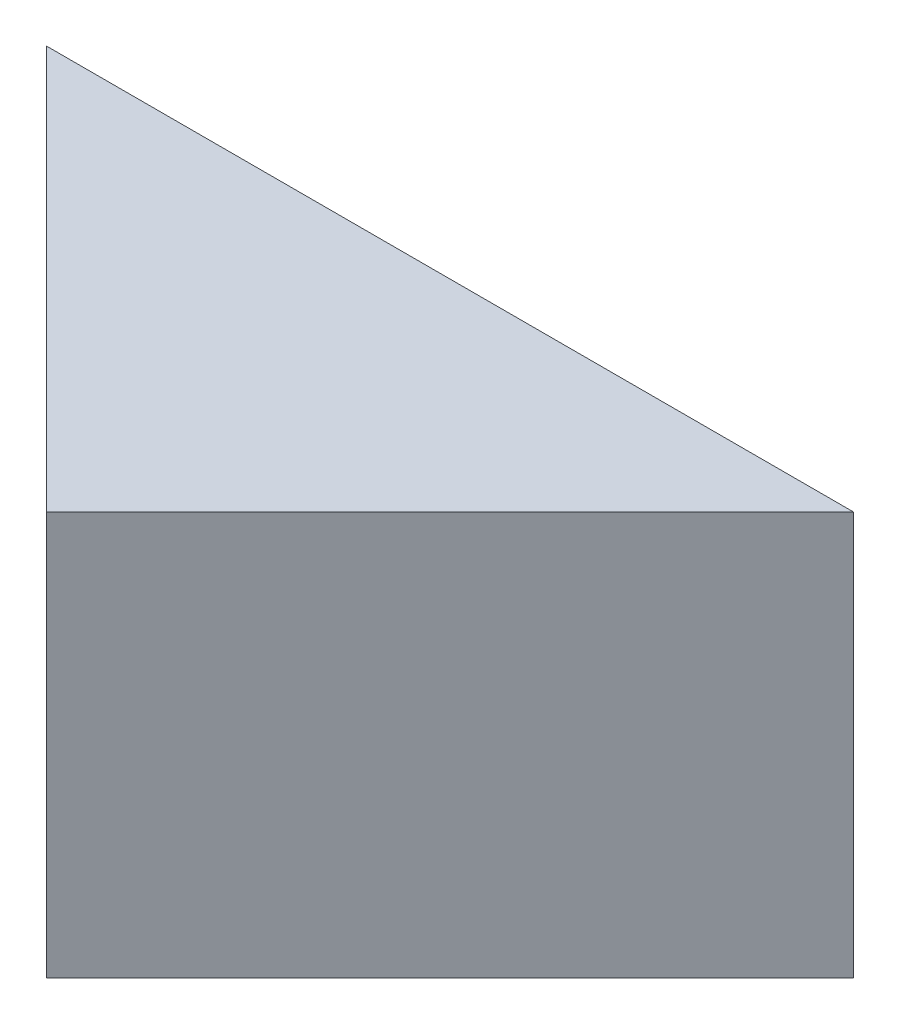
ISO-10303-21;
HEADER;
FILE_DESCRIPTION(('STEP AP214'),'2;1');
FILE_NAME('part.step','',(''),(''),'','','');
FILE_SCHEMA(('AUTOMOTIVE_DESIGN { 1 0 10303 214 1 1 1 1 }'));
ENDSEC;
DATA;
#1=APPLICATION_CONTEXT('core data for automotive mechanical design processes');
#2=APPLICATION_PROTOCOL_DEFINITION('international standard','automotive_design',2000,#1);
#3=PRODUCT_CONTEXT('',#1,'mechanical');
#4=PRODUCT('Part','Part','',(#3));
#5=PRODUCT_RELATED_PRODUCT_CATEGORY('part','',(#4));
#6=PRODUCT_DEFINITION_FORMATION('','',#4);
#7=PRODUCT_DEFINITION_CONTEXT('part definition',#1,'design');
#8=PRODUCT_DEFINITION('design','',#6,#7);
#9=PRODUCT_DEFINITION_SHAPE('','',#8);
#10=(LENGTH_UNIT() NAMED_UNIT(*) SI_UNIT(.MILLI.,.METRE.));
#11=(NAMED_UNIT(*) PLANE_ANGLE_UNIT() SI_UNIT($,.RADIAN.));
#12=(NAMED_UNIT(*) SI_UNIT($,.STERADIAN.) SOLID_ANGLE_UNIT());
#13=UNCERTAINTY_MEASURE_WITH_UNIT(LENGTH_MEASURE(1.E-05),#10,'distance_accuracy_value','');
#14=(GEOMETRIC_REPRESENTATION_CONTEXT(3) GLOBAL_UNCERTAINTY_ASSIGNED_CONTEXT((#13)) GLOBAL_UNIT_ASSIGNED_CONTEXT((#10,
#11,#12)) REPRESENTATION_CONTEXT('',''));
#15=CARTESIAN_POINT('',(0.,0.,0.));
#16=DIRECTION('',(0.,0.,1.));
#17=DIRECTION('',(1.,0.,0.));
#18=AXIS2_PLACEMENT_3D('',#15,#16,#17);
#19=CARTESIAN_POINT('',(20.,20.,0.));
#20=DIRECTION('',(-0.707106781186544,0.,-0.707106781186551));
#21=DIRECTION('',(-0.707106781186551,0.,0.707106781186544));
#22=AXIS2_PLACEMENT_3D('',#19,#20,#21);
#23=PLANE('',#22);
#24=DIRECTION('',(0.707106781186551,0.,-0.707106781186544));
#25=VECTOR('',#24,1.);
#26=CARTESIAN_POINT('',(20.,0.,0.));
#27=LINE('',#26,#25);
#28=CARTESIAN_POINT('',(0.,0.,19.9999999999998));
#29=VERTEX_POINT('',#28);
#30=CARTESIAN_POINT('',(20.,0.,0.));
#31=VERTEX_POINT('',#30);
#32=EDGE_CURVE('E89',#29,#31,#27,.T.);
#33=ORIENTED_EDGE('',*,*,#32,.T.);
#34=DIRECTION('',(0.,-1.,0.));
#35=VECTOR('',#34,1.);
#36=CARTESIAN_POINT('',(20.,20.,0.));
#37=LINE('',#36,#35);
#38=CARTESIAN_POINT('',(20.,20.,0.));
#39=VERTEX_POINT('',#38);
#40=EDGE_CURVE('E11',#39,#31,#37,.T.);
#41=ORIENTED_EDGE('',*,*,#40,.F.);
#42=DIRECTION('',(0.707106781186551,0.,-0.707106781186544));
#43=VECTOR('',#42,1.);
#44=CARTESIAN_POINT('',(20.,20.,0.));
#45=LINE('',#44,#43);
#46=CARTESIAN_POINT('',(0.,20.,19.9999999999998));
#47=VERTEX_POINT('',#46);
#48=EDGE_CURVE('E81',#47,#39,#45,.T.);
#49=ORIENTED_EDGE('',*,*,#48,.F.);
#50=DIRECTION('',(0.,-1.,0.));
#51=VECTOR('',#50,1.);
#52=CARTESIAN_POINT('',(0.,20.,19.9999999999998));
#53=LINE('',#52,#51);
#54=EDGE_CURVE('E90',#47,#29,#53,.T.);
#55=ORIENTED_EDGE('',*,*,#54,.T.);
#56=EDGE_LOOP('',(#33,#41,#49,#55));
#57=FACE_BOUND('',#56,.T.);
#58=ADVANCED_FACE('F39',(#57),#23,.F.);
#59=CARTESIAN_POINT('',(-20.,20.,0.));
#60=DIRECTION('',(0.,0.,1.));
#61=DIRECTION('',(1.,0.,0.));
#62=AXIS2_PLACEMENT_3D('',#59,#60,#61);
#63=PLANE('',#62);
#64=DIRECTION('',(-1.,0.,0.));
#65=VECTOR('',#64,1.);
#66=CARTESIAN_POINT('',(-20.,0.,0.));
#67=LINE('',#66,#65);
#68=CARTESIAN_POINT('',(-20.,0.,0.));
#69=VERTEX_POINT('',#68);
#70=EDGE_CURVE('E68',#31,#69,#67,.T.);
#71=ORIENTED_EDGE('',*,*,#70,.T.);
#72=DIRECTION('',(0.,-1.,0.));
#73=VECTOR('',#72,1.);
#74=CARTESIAN_POINT('',(-20.,20.,0.));
#75=LINE('',#74,#73);
#76=CARTESIAN_POINT('',(-20.,20.,0.));
#77=VERTEX_POINT('',#76);
#78=EDGE_CURVE('E48',#77,#69,#75,.T.);
#79=ORIENTED_EDGE('',*,*,#78,.F.);
#80=DIRECTION('',(-1.,0.,0.));
#81=VECTOR('',#80,1.);
#82=CARTESIAN_POINT('',(-20.,20.,0.));
#83=LINE('',#82,#81);
#84=EDGE_CURVE('E76',#39,#77,#83,.T.);
#85=ORIENTED_EDGE('',*,*,#84,.F.);
#86=ORIENTED_EDGE('',*,*,#40,.T.);
#87=EDGE_LOOP('',(#71,#79,#85,#86));
#88=FACE_BOUND('',#87,.T.);
#89=ADVANCED_FACE('F77',(#88),#63,.F.);
#90=CARTESIAN_POINT('',(-20.,20.,0.));
#91=DIRECTION('',(0.707106781186544,0.,-0.707106781186551));
#92=DIRECTION('',(-0.707106781186551,0.,-0.707106781186544));
#93=AXIS2_PLACEMENT_3D('',#90,#91,#92);
#94=PLANE('',#93);
#95=DIRECTION('',(0.707106781186551,0.,0.707106781186544));
#96=VECTOR('',#95,1.);
#97=CARTESIAN_POINT('',(-20.,0.,0.));
#98=LINE('',#97,#96);
#99=EDGE_CURVE('E73',#69,#29,#98,.T.);
#100=ORIENTED_EDGE('',*,*,#99,.T.);
#101=ORIENTED_EDGE('',*,*,#54,.F.);
#102=DIRECTION('',(0.707106781186551,0.,0.707106781186544));
#103=VECTOR('',#102,1.);
#104=CARTESIAN_POINT('',(-20.,20.,0.));
#105=LINE('',#104,#103);
#106=EDGE_CURVE('E56',#77,#47,#105,.T.);
#107=ORIENTED_EDGE('',*,*,#106,.F.);
#108=ORIENTED_EDGE('',*,*,#78,.T.);
#109=EDGE_LOOP('',(#100,#101,#107,#108));
#110=FACE_BOUND('',#109,.T.);
#111=ADVANCED_FACE('F102',(#110),#94,.F.);
#112=CARTESIAN_POINT('',(0.,20.,0.));
#113=DIRECTION('',(0.,1.,0.));
#114=DIRECTION('',(0.,0.,1.));
#115=AXIS2_PLACEMENT_3D('',#112,#113,#114);
#116=PLANE('',#115);
#117=ORIENTED_EDGE('',*,*,#48,.T.);
#118=ORIENTED_EDGE('',*,*,#84,.T.);
#119=ORIENTED_EDGE('',*,*,#106,.T.);
#120=EDGE_LOOP('',(#117,#118,#119));
#121=FACE_BOUND('',#120,.T.);
#122=ADVANCED_FACE('F84',(#121),#116,.T.);
#123=CARTESIAN_POINT('',(0.,0.,0.));
#124=DIRECTION('',(0.,1.,0.));
#125=DIRECTION('',(0.,0.,1.));
#126=AXIS2_PLACEMENT_3D('',#123,#124,#125);
#127=PLANE('',#126);
#128=ORIENTED_EDGE('',*,*,#32,.F.);
#129=ORIENTED_EDGE('',*,*,#99,.F.);
#130=ORIENTED_EDGE('',*,*,#70,.F.);
#131=EDGE_LOOP('',(#128,#129,#130));
#132=FACE_BOUND('',#131,.T.);
#133=ADVANCED_FACE('F103',(#132),#127,.F.);
#134=CLOSED_SHELL('',(#58,#89,#111,#122,#133));
#135=MANIFOLD_SOLID_BREP('B2',#134);
#136=ADVANCED_BREP_SHAPE_REPRESENTATION('',(#18,#135),#14);
#137=SHAPE_DEFINITION_REPRESENTATION(#9,#136);
ENDSEC;
END-ISO-10303-21;
